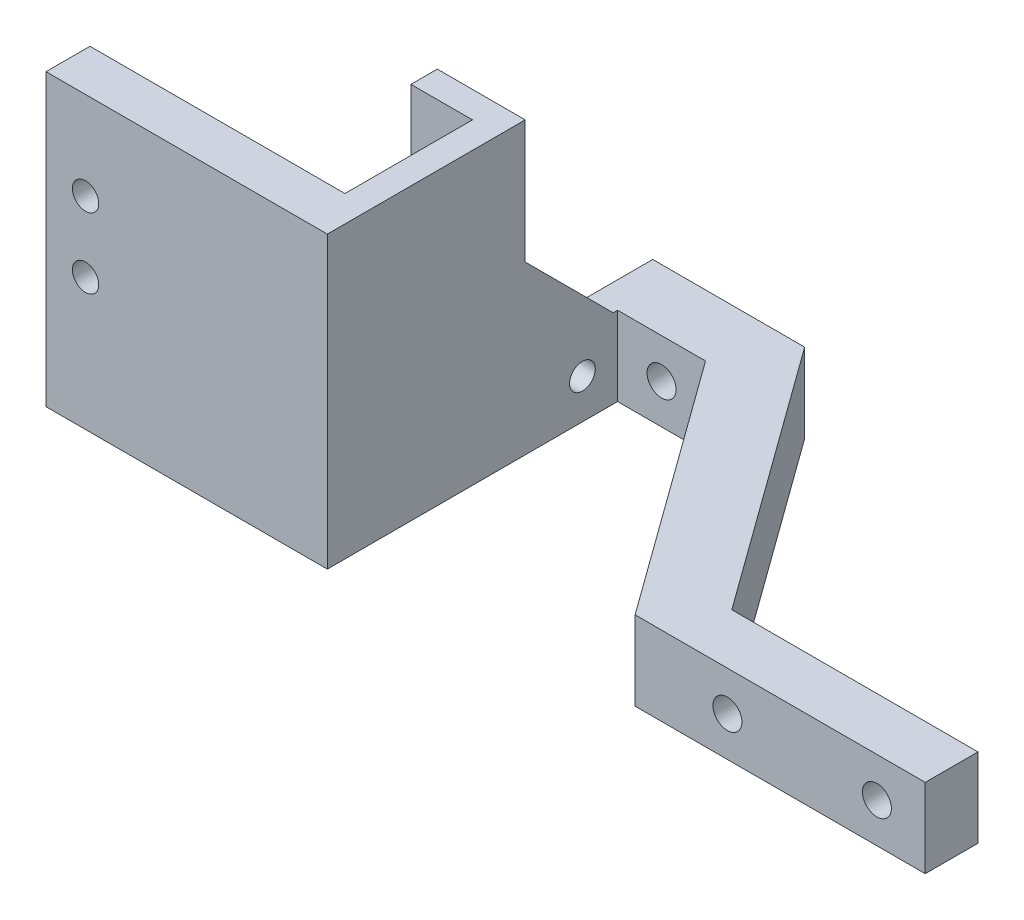
ISO-10303-21;
HEADER;
FILE_DESCRIPTION(('STEP AP214'),'2;1');
FILE_NAME('part.step','',(''),(''),'','','');
FILE_SCHEMA(('AUTOMOTIVE_DESIGN { 1 0 10303 214 1 1 1 1 }'));
ENDSEC;
DATA;
#1=APPLICATION_CONTEXT('core data for automotive mechanical design processes');
#2=APPLICATION_PROTOCOL_DEFINITION('international standard','automotive_design',2000,#1);
#3=PRODUCT_CONTEXT('',#1,'mechanical');
#4=PRODUCT('Part','Part','',(#3));
#5=PRODUCT_RELATED_PRODUCT_CATEGORY('part','',(#4));
#6=PRODUCT_DEFINITION_FORMATION('','',#4);
#7=PRODUCT_DEFINITION_CONTEXT('part definition',#1,'design');
#8=PRODUCT_DEFINITION('design','',#6,#7);
#9=PRODUCT_DEFINITION_SHAPE('','',#8);
#10=(LENGTH_UNIT() NAMED_UNIT(*) SI_UNIT(.MILLI.,.METRE.));
#11=(NAMED_UNIT(*) PLANE_ANGLE_UNIT() SI_UNIT($,.RADIAN.));
#12=(NAMED_UNIT(*) SI_UNIT($,.STERADIAN.) SOLID_ANGLE_UNIT());
#13=UNCERTAINTY_MEASURE_WITH_UNIT(LENGTH_MEASURE(1.E-05),#10,'distance_accuracy_value','');
#14=(GEOMETRIC_REPRESENTATION_CONTEXT(3) GLOBAL_UNCERTAINTY_ASSIGNED_CONTEXT((#13)) GLOBAL_UNIT_ASSIGNED_CONTEXT((#10,
#11,#12)) REPRESENTATION_CONTEXT('',''));
#15=CARTESIAN_POINT('',(0.,0.,0.));
#16=DIRECTION('',(0.,0.,1.));
#17=DIRECTION('',(1.,0.,0.));
#18=AXIS2_PLACEMENT_3D('',#15,#16,#17);
#19=CARTESIAN_POINT('',(28.,9.,-6.));
#20=DIRECTION('',(0.,-1.,0.));
#21=DIRECTION('',(0.,0.,1.));
#22=AXIS2_PLACEMENT_3D('',#19,#20,#21);
#23=PLANE('',#22);
#24=DIRECTION('',(0.,0.,1.));
#25=VECTOR('',#24,1.);
#26=CARTESIAN_POINT('',(-36.,9.,-36.0090319770748));
#27=LINE('',#26,#25);
#28=CARTESIAN_POINT('',(-36.,9.,-29.0090319770748));
#29=VERTEX_POINT('',#28);
#30=CARTESIAN_POINT('',(-36.,9.,-28.5045159885374));
#31=VERTEX_POINT('',#30);
#32=EDGE_CURVE('E249',#29,#31,#27,.T.);
#33=ORIENTED_EDGE('',*,*,#32,.F.);
#34=DIRECTION('',(-1.,0.,0.));
#35=VECTOR('',#34,1.);
#36=CARTESIAN_POINT('',(-26.,9.,-29.0090319770748));
#37=LINE('',#36,#35);
#38=CARTESIAN_POINT('',(-26.,9.,-29.0090319770748));
#39=VERTEX_POINT('',#38);
#40=EDGE_CURVE('E267',#39,#29,#37,.T.);
#41=ORIENTED_EDGE('',*,*,#40,.F.);
#42=DIRECTION('',(-0.58638999951857,0.,-0.810028868908147));
#43=VECTOR('',#42,1.);
#44=CARTESIAN_POINT('',(-5.,9.,0.));
#45=LINE('',#44,#43);
#46=CARTESIAN_POINT('',(-5.,9.,0.));
#47=VERTEX_POINT('',#46);
#48=EDGE_CURVE('E271',#47,#39,#45,.T.);
#49=ORIENTED_EDGE('',*,*,#48,.F.);
#50=DIRECTION('',(-1.,0.,0.));
#51=VECTOR('',#50,1.);
#52=CARTESIAN_POINT('',(28.,9.,0.));
#53=LINE('',#52,#51);
#54=CARTESIAN_POINT('',(28.,9.,0.));
#55=VERTEX_POINT('',#54);
#56=EDGE_CURVE('E312',#55,#47,#53,.T.);
#57=ORIENTED_EDGE('',*,*,#56,.F.);
#58=DIRECTION('',(0.,0.,1.));
#59=VECTOR('',#58,1.);
#60=CARTESIAN_POINT('',(28.,9.,-6.));
#61=LINE('',#60,#59);
#62=CARTESIAN_POINT('',(28.,9.,-6.));
#63=VERTEX_POINT('',#62);
#64=EDGE_CURVE('E320',#63,#55,#61,.T.);
#65=ORIENTED_EDGE('',*,*,#64,.F.);
#66=DIRECTION('',(-1.,0.,0.));
#67=VECTOR('',#66,1.);
#68=CARTESIAN_POINT('',(28.,9.,-6.));
#69=LINE('',#68,#67);
#70=CARTESIAN_POINT('',(0.,9.,-6.));
#71=VERTEX_POINT('',#70);
#72=EDGE_CURVE('E317',#63,#71,#69,.T.);
#73=ORIENTED_EDGE('',*,*,#72,.T.);
#74=DIRECTION('',(0.58638999951857,0.,0.810028868908147));
#75=VECTOR('',#74,1.);
#76=CARTESIAN_POINT('',(-21.723912470316,9.,-36.0090319770748));
#77=LINE('',#76,#75);
#78=CARTESIAN_POINT('',(-21.723912470316,9.,-36.0090319770748));
#79=VERTEX_POINT('',#78);
#80=EDGE_CURVE('E274',#79,#71,#77,.T.);
#81=ORIENTED_EDGE('',*,*,#80,.F.);
#82=DIRECTION('',(1.,0.,0.));
#83=VECTOR('',#82,1.);
#84=CARTESIAN_POINT('',(-36.,9.,-36.0090319770748));
#85=LINE('',#84,#83);
#86=CARTESIAN_POINT('',(-39.,9.00000000000001,-36.0090319770748));
#87=VERTEX_POINT('',#86);
#88=EDGE_CURVE('E264',#87,#79,#85,.T.);
#89=ORIENTED_EDGE('',*,*,#88,.F.);
#90=DIRECTION('',(0.,0.,-1.));
#91=VECTOR('',#90,1.);
#92=CARTESIAN_POINT('',(-39.,9.,-36.0090319770748));
#93=LINE('',#92,#91);
#94=CARTESIAN_POINT('',(-39.,9.,-28.5045159885374));
#95=VERTEX_POINT('',#94);
#96=EDGE_CURVE('E247',#95,#87,#93,.T.);
#97=ORIENTED_EDGE('',*,*,#96,.F.);
#98=DIRECTION('',(-1.,0.,0.));
#99=VECTOR('',#98,1.);
#100=CARTESIAN_POINT('',(-39.,9.,-28.5045159885374));
#101=LINE('',#100,#99);
#102=EDGE_CURVE('E336',#31,#95,#101,.T.);
#103=ORIENTED_EDGE('',*,*,#102,.F.);
#104=EDGE_LOOP('',(#33,#41,#49,#57,#65,#73,#81,#89,#97,#103));
#105=FACE_BOUND('',#104,.T.);
#106=ADVANCED_FACE('F35',(#105),#23,.F.);
#107=CARTESIAN_POINT('',(0.,0.,-1.00000000000003));
#108=DIRECTION('',(0.,0.,-1.));
#109=DIRECTION('',(1.,0.,0.));
#110=AXIS2_PLACEMENT_3D('',#107,#108,#109);
#111=PLANE('',#110);
#112=CARTESIAN_POINT('',(-63.5,23.,-1.00000000000003));
#113=DIRECTION('',(0.,0.,1.));
#114=DIRECTION('',(1.,0.,0.));
#115=AXIS2_PLACEMENT_3D('',#112,#113,#114);
#116=CIRCLE('',#115,1.5);
#117=CARTESIAN_POINT('',(-62.,23.,-1.00000000000003));
#118=VERTEX_POINT('',#117);
#119=EDGE_CURVE('E565',#118,#118,#116,.T.);
#120=ORIENTED_EDGE('',*,*,#119,.T.);
#121=EDGE_LOOP('',(#120));
#122=FACE_BOUND('',#121,.T.);
#123=CARTESIAN_POINT('',(-63.5,15.,-0.999999999999976));
#124=DIRECTION('',(0.,0.,-1.));
#125=DIRECTION('',(-1.,0.,0.));
#126=AXIS2_PLACEMENT_3D('',#123,#124,#125);
#127=CIRCLE('',#126,1.5);
#128=CARTESIAN_POINT('',(-65.,15.,-0.999999999999974));
#129=VERTEX_POINT('',#128);
#130=EDGE_CURVE('E213',#129,#129,#127,.T.);
#131=ORIENTED_EDGE('',*,*,#130,.F.);
#132=EDGE_LOOP('',(#131));
#133=FACE_BOUND('',#132,.T.);
#134=DIRECTION('',(0.,1.,0.));
#135=VECTOR('',#134,1.);
#136=CARTESIAN_POINT('',(-39.,49.1213489272556,-0.999999999999994));
#137=LINE('',#136,#135);
#138=CARTESIAN_POINT('',(-39.,0.,-0.999999999999994));
#139=VERTEX_POINT('',#138);
#140=CARTESIAN_POINT('',(-39.,33.,-0.999999999999999));
#141=VERTEX_POINT('',#140);
#142=EDGE_CURVE('E331',#139,#141,#137,.T.);
#143=ORIENTED_EDGE('',*,*,#142,.F.);
#144=DIRECTION('',(-1.,0.,0.));
#145=VECTOR('',#144,1.);
#146=CARTESIAN_POINT('',(-36.,0.,-0.999999999999999));
#147=LINE('',#146,#145);
#148=CARTESIAN_POINT('',(-68.,0.,-0.999999999999971));
#149=VERTEX_POINT('',#148);
#150=EDGE_CURVE('E219',#139,#149,#147,.T.);
#151=ORIENTED_EDGE('',*,*,#150,.T.);
#152=DIRECTION('',(0.,1.,0.));
#153=VECTOR('',#152,1.);
#154=CARTESIAN_POINT('',(-68.,0.,-0.999999999999971));
#155=LINE('',#154,#153);
#156=CARTESIAN_POINT('',(-68.,33.,-0.999999999999971));
#157=VERTEX_POINT('',#156);
#158=EDGE_CURVE('E222',#149,#157,#155,.T.);
#159=ORIENTED_EDGE('',*,*,#158,.T.);
#160=DIRECTION('',(1.,0.,0.));
#161=VECTOR('',#160,1.);
#162=CARTESIAN_POINT('',(-36.,33.,-0.999999999999999));
#163=LINE('',#162,#161);
#164=EDGE_CURVE('E226',#157,#141,#163,.T.);
#165=ORIENTED_EDGE('',*,*,#164,.T.);
#166=EDGE_LOOP('',(#143,#151,#159,#165));
#167=FACE_BOUND('',#166,.T.);
#168=ADVANCED_FACE('F354',(#122,#133,#167),#111,.T.);
#169=CARTESIAN_POINT('',(0.,0.,-6.));
#170=DIRECTION('',(0.,0.,-1.));
#171=DIRECTION('',(1.,0.,0.));
#172=AXIS2_PLACEMENT_3D('',#169,#170,#171);
#173=PLANE('',#172);
#174=CARTESIAN_POINT('',(5.5,4.5,-6.));
#175=DIRECTION('',(0.,0.,1.));
#176=DIRECTION('',(1.,0.,0.));
#177=AXIS2_PLACEMENT_3D('',#174,#175,#176);
#178=CIRCLE('',#177,1.65);
#179=CARTESIAN_POINT('',(7.15,4.5,-6.));
#180=VERTEX_POINT('',#179);
#181=EDGE_CURVE('E302',#180,#180,#178,.T.);
#182=ORIENTED_EDGE('',*,*,#181,.T.);
#183=EDGE_LOOP('',(#182));
#184=FACE_BOUND('',#183,.T.);
#185=DIRECTION('',(0.,-1.,0.));
#186=VECTOR('',#185,1.);
#187=CARTESIAN_POINT('',(0.,9.,-6.));
#188=LINE('',#187,#186);
#189=CARTESIAN_POINT('',(0.,0.,-6.));
#190=VERTEX_POINT('',#189);
#191=EDGE_CURVE('E308',#71,#190,#188,.T.);
#192=ORIENTED_EDGE('',*,*,#191,.F.);
#193=ORIENTED_EDGE('',*,*,#72,.F.);
#194=DIRECTION('',(0.,1.,0.));
#195=VECTOR('',#194,1.);
#196=CARTESIAN_POINT('',(28.,0.,-6.));
#197=LINE('',#196,#195);
#198=CARTESIAN_POINT('',(28.,0.,-6.));
#199=VERTEX_POINT('',#198);
#200=EDGE_CURVE('E315',#199,#63,#197,.T.);
#201=ORIENTED_EDGE('',*,*,#200,.F.);
#202=DIRECTION('',(1.,0.,0.));
#203=VECTOR('',#202,1.);
#204=CARTESIAN_POINT('',(0.,0.,-6.));
#205=LINE('',#204,#203);
#206=EDGE_CURVE('E311',#190,#199,#205,.T.);
#207=ORIENTED_EDGE('',*,*,#206,.F.);
#208=EDGE_LOOP('',(#192,#193,#201,#207));
#209=FACE_BOUND('',#208,.T.);
#210=CARTESIAN_POINT('',(22.5,4.5,-6.));
#211=DIRECTION('',(0.,0.,1.));
#212=DIRECTION('',(1.,0.,0.));
#213=AXIS2_PLACEMENT_3D('',#210,#211,#212);
#214=CIRCLE('',#213,1.65);
#215=CARTESIAN_POINT('',(24.15,4.5,-6.));
#216=VERTEX_POINT('',#215);
#217=EDGE_CURVE('E296',#216,#216,#214,.T.);
#218=ORIENTED_EDGE('',*,*,#217,.T.);
#219=EDGE_LOOP('',(#218));
#220=FACE_BOUND('',#219,.T.);
#221=ADVANCED_FACE('F387',(#184,#209,#220),#173,.T.);
#222=CARTESIAN_POINT('',(0.,0.,0.));
#223=DIRECTION('',(0.,0.,-1.));
#224=DIRECTION('',(1.,0.,0.));
#225=AXIS2_PLACEMENT_3D('',#222,#223,#224);
#226=PLANE('',#225);
#227=DIRECTION('',(1.,0.,0.));
#228=VECTOR('',#227,1.);
#229=CARTESIAN_POINT('',(0.,0.,0.));
#230=LINE('',#229,#228);
#231=CARTESIAN_POINT('',(-5.,0.,0.));
#232=VERTEX_POINT('',#231);
#233=CARTESIAN_POINT('',(28.,0.,0.));
#234=VERTEX_POINT('',#233);
#235=EDGE_CURVE('E305',#232,#234,#230,.T.);
#236=ORIENTED_EDGE('',*,*,#235,.T.);
#237=DIRECTION('',(0.,1.,0.));
#238=VECTOR('',#237,1.);
#239=CARTESIAN_POINT('',(28.,0.,0.));
#240=LINE('',#239,#238);
#241=EDGE_CURVE('E323',#234,#55,#240,.T.);
#242=ORIENTED_EDGE('',*,*,#241,.T.);
#243=ORIENTED_EDGE('',*,*,#56,.T.);
#244=DIRECTION('',(0.,-1.,0.));
#245=VECTOR('',#244,1.);
#246=CARTESIAN_POINT('',(-5.,59.9180752181973,0.));
#247=LINE('',#246,#245);
#248=EDGE_CURVE('E268',#47,#232,#247,.T.);
#249=ORIENTED_EDGE('',*,*,#248,.T.);
#250=EDGE_LOOP('',(#236,#242,#243,#249));
#251=FACE_BOUND('',#250,.T.);
#252=CARTESIAN_POINT('',(5.5,4.5,0.));
#253=DIRECTION('',(0.,0.,1.));
#254=DIRECTION('',(1.,0.,0.));
#255=AXIS2_PLACEMENT_3D('',#252,#253,#254);
#256=CIRCLE('',#255,1.65);
#257=CARTESIAN_POINT('',(7.15,4.5,0.));
#258=VERTEX_POINT('',#257);
#259=EDGE_CURVE('E299',#258,#258,#256,.T.);
#260=ORIENTED_EDGE('',*,*,#259,.F.);
#261=EDGE_LOOP('',(#260));
#262=FACE_BOUND('',#261,.T.);
#263=CARTESIAN_POINT('',(22.5,4.5,0.));
#264=DIRECTION('',(0.,0.,1.));
#265=DIRECTION('',(1.,0.,0.));
#266=AXIS2_PLACEMENT_3D('',#263,#264,#265);
#267=CIRCLE('',#266,1.65);
#268=CARTESIAN_POINT('',(24.15,4.5,0.));
#269=VERTEX_POINT('',#268);
#270=EDGE_CURVE('E295',#269,#269,#267,.T.);
#271=ORIENTED_EDGE('',*,*,#270,.F.);
#272=EDGE_LOOP('',(#271));
#273=FACE_BOUND('',#272,.T.);
#274=ADVANCED_FACE('F377',(#251,#262,#273),#226,.F.);
#275=CARTESIAN_POINT('',(0.,0.,-6.));
#276=DIRECTION('',(0.,1.,0.));
#277=DIRECTION('',(0.,0.,-1.));
#278=AXIS2_PLACEMENT_3D('',#275,#276,#277);
#279=PLANE('',#278);
#280=DIRECTION('',(0.,0.,1.));
#281=VECTOR('',#280,1.);
#282=CARTESIAN_POINT('',(-39.,0.,-36.0090319770748));
#283=LINE('',#282,#281);
#284=CARTESIAN_POINT('',(-39.,0.,-36.0090319770748));
#285=VERTEX_POINT('',#284);
#286=EDGE_CURVE('E256',#285,#139,#283,.T.);
#287=ORIENTED_EDGE('',*,*,#286,.F.);
#288=DIRECTION('',(-1.,0.,0.));
#289=VECTOR('',#288,1.);
#290=CARTESIAN_POINT('',(-36.,0.,-36.0090319770748));
#291=LINE('',#290,#289);
#292=CARTESIAN_POINT('',(-21.723912470316,0.,-36.0090319770748));
#293=VERTEX_POINT('',#292);
#294=EDGE_CURVE('E277',#293,#285,#291,.T.);
#295=ORIENTED_EDGE('',*,*,#294,.F.);
#296=DIRECTION('',(-0.58638999951857,0.,-0.810028868908147));
#297=VECTOR('',#296,1.);
#298=CARTESIAN_POINT('',(-21.723912470316,0.,-36.0090319770748));
#299=LINE('',#298,#297);
#300=EDGE_CURVE('E253',#190,#293,#299,.T.);
#301=ORIENTED_EDGE('',*,*,#300,.F.);
#302=ORIENTED_EDGE('',*,*,#206,.T.);
#303=DIRECTION('',(0.,0.,1.));
#304=VECTOR('',#303,1.);
#305=CARTESIAN_POINT('',(28.,0.,-6.));
#306=LINE('',#305,#304);
#307=EDGE_CURVE('E329',#199,#234,#306,.T.);
#308=ORIENTED_EDGE('',*,*,#307,.T.);
#309=ORIENTED_EDGE('',*,*,#235,.F.);
#310=DIRECTION('',(0.58638999951857,0.,0.810028868908147));
#311=VECTOR('',#310,1.);
#312=CARTESIAN_POINT('',(-5.,0.,0.));
#313=LINE('',#312,#311);
#314=CARTESIAN_POINT('',(-26.,0.,-29.0090319770748));
#315=VERTEX_POINT('',#314);
#316=EDGE_CURVE('E283',#315,#232,#313,.T.);
#317=ORIENTED_EDGE('',*,*,#316,.F.);
#318=DIRECTION('',(1.,0.,0.));
#319=VECTOR('',#318,1.);
#320=CARTESIAN_POINT('',(-26.,0.,-29.0090319770748));
#321=LINE('',#320,#319);
#322=CARTESIAN_POINT('',(-36.,0.,-29.0090319770748));
#323=VERTEX_POINT('',#322);
#324=EDGE_CURVE('E280',#323,#315,#321,.T.);
#325=ORIENTED_EDGE('',*,*,#324,.F.);
#326=DIRECTION('',(0.,0.,-1.));
#327=VECTOR('',#326,1.);
#328=CARTESIAN_POINT('',(-36.,0.,-36.0090319770748));
#329=LINE('',#328,#327);
#330=CARTESIAN_POINT('',(-36.,0.,4.));
#331=VERTEX_POINT('',#330);
#332=EDGE_CURVE('E246',#331,#323,#329,.T.);
#333=ORIENTED_EDGE('',*,*,#332,.F.);
#334=DIRECTION('',(1.,0.,0.));
#335=VECTOR('',#334,1.);
#336=CARTESIAN_POINT('',(-36.,0.,4.));
#337=LINE('',#336,#335);
#338=CARTESIAN_POINT('',(-68.,0.,4.00000000000003));
#339=VERTEX_POINT('',#338);
#340=EDGE_CURVE('E258',#339,#331,#337,.T.);
#341=ORIENTED_EDGE('',*,*,#340,.F.);
#342=DIRECTION('',(0.,0.,1.));
#343=VECTOR('',#342,1.);
#344=CARTESIAN_POINT('',(-68.,0.,-0.999999999999971));
#345=LINE('',#344,#343);
#346=EDGE_CURVE('E229',#149,#339,#345,.T.);
#347=ORIENTED_EDGE('',*,*,#346,.F.);
#348=ORIENTED_EDGE('',*,*,#150,.F.);
#349=EDGE_LOOP('',(#287,#295,#301,#302,#308,#309,#317,#325,#333,#341,#347,#348));
#350=FACE_BOUND('',#349,.T.);
#351=ADVANCED_FACE('F349',(#350),#279,.F.);
#352=CARTESIAN_POINT('',(28.,0.,-6.));
#353=DIRECTION('',(-1.,0.,0.));
#354=DIRECTION('',(0.,0.,-1.));
#355=AXIS2_PLACEMENT_3D('',#352,#353,#354);
#356=PLANE('',#355);
#357=ORIENTED_EDGE('',*,*,#241,.F.);
#358=ORIENTED_EDGE('',*,*,#307,.F.);
#359=ORIENTED_EDGE('',*,*,#200,.T.);
#360=ORIENTED_EDGE('',*,*,#64,.T.);
#361=EDGE_LOOP('',(#357,#358,#359,#360));
#362=FACE_BOUND('',#361,.T.);
#363=ADVANCED_FACE('F383',(#362),#356,.F.);
#364=CARTESIAN_POINT('',(5.5,4.5,-6.));
#365=DIRECTION('',(0.,0.,1.));
#366=DIRECTION('',(-1.,0.,0.));
#367=AXIS2_PLACEMENT_3D('',#364,#365,#366);
#368=CYLINDRICAL_SURFACE('',#367,1.65);
#369=ORIENTED_EDGE('',*,*,#181,.F.);
#370=EDGE_LOOP('',(#369));
#371=FACE_BOUND('',#370,.T.);
#372=ORIENTED_EDGE('',*,*,#259,.T.);
#373=EDGE_LOOP('',(#372));
#374=FACE_BOUND('',#373,.T.);
#375=ADVANCED_FACE('F422',(#371,#374),#368,.F.);
#376=CARTESIAN_POINT('',(22.5,4.5,-6.));
#377=DIRECTION('',(0.,0.,1.));
#378=DIRECTION('',(-1.,0.,0.));
#379=AXIS2_PLACEMENT_3D('',#376,#377,#378);
#380=CYLINDRICAL_SURFACE('',#379,1.65);
#381=ORIENTED_EDGE('',*,*,#217,.F.);
#382=EDGE_LOOP('',(#381));
#383=FACE_BOUND('',#382,.T.);
#384=ORIENTED_EDGE('',*,*,#270,.T.);
#385=EDGE_LOOP('',(#384));
#386=FACE_BOUND('',#385,.T.);
#387=ADVANCED_FACE('F436',(#383,#386),#380,.F.);
#388=CARTESIAN_POINT('',(-5.,59.9180752181973,0.));
#389=DIRECTION('',(-0.810028868908147,0.,0.58638999951857));
#390=DIRECTION('',(-0.58638999951857,0.,-0.810028868908147));
#391=AXIS2_PLACEMENT_3D('',#388,#389,#390);
#392=PLANE('',#391);
#393=ORIENTED_EDGE('',*,*,#48,.T.);
#394=DIRECTION('',(0.,-1.,0.));
#395=VECTOR('',#394,1.);
#396=CARTESIAN_POINT('',(-26.,59.9180752181973,-29.0090319770748));
#397=LINE('',#396,#395);
#398=EDGE_CURVE('E288',#39,#315,#397,.T.);
#399=ORIENTED_EDGE('',*,*,#398,.T.);
#400=ORIENTED_EDGE('',*,*,#316,.T.);
#401=ORIENTED_EDGE('',*,*,#248,.F.);
#402=EDGE_LOOP('',(#393,#399,#400,#401));
#403=FACE_BOUND('',#402,.T.);
#404=ADVANCED_FACE('F374',(#403),#392,.T.);
#405=CARTESIAN_POINT('',(-26.,59.9180752181973,-29.0090319770748));
#406=DIRECTION('',(0.,0.,1.));
#407=DIRECTION('',(-1.,0.,0.));
#408=AXIS2_PLACEMENT_3D('',#405,#406,#407);
#409=PLANE('',#408);
#410=CARTESIAN_POINT('',(-31.,4.5,-29.0090319770748));
#411=DIRECTION('',(0.,0.,-1.));
#412=DIRECTION('',(-1.,0.,0.));
#413=AXIS2_PLACEMENT_3D('',#410,#411,#412);
#414=CIRCLE('',#413,1.65);
#415=CARTESIAN_POINT('',(-32.65,4.5,-29.0090319770748));
#416=VERTEX_POINT('',#415);
#417=EDGE_CURVE('E243',#416,#416,#414,.F.);
#418=ORIENTED_EDGE('',*,*,#417,.F.);
#419=EDGE_LOOP('',(#418));
#420=FACE_BOUND('',#419,.T.);
#421=ORIENTED_EDGE('',*,*,#40,.T.);
#422=DIRECTION('',(0.,-1.,0.));
#423=VECTOR('',#422,1.);
#424=CARTESIAN_POINT('',(-36.,59.9180752181973,-29.0090319770748));
#425=LINE('',#424,#423);
#426=EDGE_CURVE('E290',#29,#323,#425,.T.);
#427=ORIENTED_EDGE('',*,*,#426,.T.);
#428=ORIENTED_EDGE('',*,*,#324,.T.);
#429=ORIENTED_EDGE('',*,*,#398,.F.);
#430=EDGE_LOOP('',(#421,#427,#428,#429));
#431=FACE_BOUND('',#430,.T.);
#432=ADVANCED_FACE('F370',(#420,#431),#409,.T.);
#433=CARTESIAN_POINT('',(-36.,59.9180752181973,-36.0090319770748));
#434=DIRECTION('',(0.,0.,-1.));
#435=DIRECTION('',(1.,0.,0.));
#436=AXIS2_PLACEMENT_3D('',#433,#434,#435);
#437=PLANE('',#436);
#438=CARTESIAN_POINT('',(-31.,4.5,-36.0090319770748));
#439=DIRECTION('',(0.,0.,1.));
#440=DIRECTION('',(1.,0.,0.));
#441=AXIS2_PLACEMENT_3D('',#438,#439,#440);
#442=CIRCLE('',#441,1.65);
#443=CARTESIAN_POINT('',(-29.35,4.5,-36.0090319770748));
#444=VERTEX_POINT('',#443);
#445=EDGE_CURVE('E236',#444,#444,#442,.T.);
#446=ORIENTED_EDGE('',*,*,#445,.T.);
#447=EDGE_LOOP('',(#446));
#448=FACE_BOUND('',#447,.T.);
#449=ORIENTED_EDGE('',*,*,#88,.T.);
#450=DIRECTION('',(0.,-1.,0.));
#451=VECTOR('',#450,1.);
#452=CARTESIAN_POINT('',(-21.723912470316,59.9180752181973,-36.0090319770748));
#453=LINE('',#452,#451);
#454=EDGE_CURVE('E285',#79,#293,#453,.T.);
#455=ORIENTED_EDGE('',*,*,#454,.T.);
#456=ORIENTED_EDGE('',*,*,#294,.T.);
#457=DIRECTION('',(0.,-1.,0.));
#458=VECTOR('',#457,1.);
#459=CARTESIAN_POINT('',(-39.,49.1213489272556,-36.0090319770748));
#460=LINE('',#459,#458);
#461=EDGE_CURVE('E261',#87,#285,#460,.T.);
#462=ORIENTED_EDGE('',*,*,#461,.F.);
#463=EDGE_LOOP('',(#449,#455,#456,#462));
#464=FACE_BOUND('',#463,.T.);
#465=ADVANCED_FACE('F347',(#448,#464),#437,.T.);
#466=CARTESIAN_POINT('',(-21.723912470316,59.9180752181973,-36.0090319770748));
#467=DIRECTION('',(0.810028868908147,0.,-0.58638999951857));
#468=DIRECTION('',(0.58638999951857,0.,0.810028868908147));
#469=AXIS2_PLACEMENT_3D('',#466,#467,#468);
#470=PLANE('',#469);
#471=ORIENTED_EDGE('',*,*,#80,.T.);
#472=ORIENTED_EDGE('',*,*,#191,.T.);
#473=ORIENTED_EDGE('',*,*,#300,.T.);
#474=ORIENTED_EDGE('',*,*,#454,.F.);
#475=EDGE_LOOP('',(#471,#472,#473,#474));
#476=FACE_BOUND('',#475,.T.);
#477=ADVANCED_FACE('F390',(#476),#470,.T.);
#478=CARTESIAN_POINT('',(-36.,49.1213489272556,-36.0090319770748));
#479=DIRECTION('',(1.,0.,0.));
#480=DIRECTION('',(0.,0.,1.));
#481=AXIS2_PLACEMENT_3D('',#478,#479,#480);
#482=PLANE('',#481);
#483=CARTESIAN_POINT('',(-36.,4.5,-25.0090319770748));
#484=DIRECTION('',(-1.,0.,0.));
#485=DIRECTION('',(0.,0.,1.));
#486=AXIS2_PLACEMENT_3D('',#483,#484,#485);
#487=CIRCLE('',#486,1.46285788975288);
#488=CARTESIAN_POINT('',(-36.,4.5,-23.5461740873219));
#489=VERTEX_POINT('',#488);
#490=EDGE_CURVE('E564',#489,#489,#487,.F.);
#491=ORIENTED_EDGE('',*,*,#490,.F.);
#492=EDGE_LOOP('',(#491));
#493=FACE_BOUND('',#492,.T.);
#494=DIRECTION('',(0.,-1.,0.));
#495=VECTOR('',#494,1.);
#496=CARTESIAN_POINT('',(-36.,49.1213489272556,4.));
#497=LINE('',#496,#495);
#498=CARTESIAN_POINT('',(-36.,33.,4.));
#499=VERTEX_POINT('',#498);
#500=EDGE_CURVE('E250',#499,#331,#497,.T.);
#501=ORIENTED_EDGE('',*,*,#500,.T.);
#502=ORIENTED_EDGE('',*,*,#332,.T.);
#503=ORIENTED_EDGE('',*,*,#426,.F.);
#504=ORIENTED_EDGE('',*,*,#32,.T.);
#505=DIRECTION('',(0.,0.707106781186551,0.707106781186544));
#506=VECTOR('',#505,1.);
#507=CARTESIAN_POINT('',(-36.,19.0000000000001,-18.5045159885374));
#508=LINE('',#507,#506);
#509=CARTESIAN_POINT('',(-36.,19.0000000000001,-18.5045159885374));
#510=VERTEX_POINT('',#509);
#511=EDGE_CURVE('E43',#510,#31,#508,.F.);
#512=ORIENTED_EDGE('',*,*,#511,.F.);
#513=DIRECTION('',(0.,-1.,0.));
#514=VECTOR('',#513,1.);
#515=CARTESIAN_POINT('',(-36.,50.7597319797615,-18.5045159885374));
#516=LINE('',#515,#514);
#517=CARTESIAN_POINT('',(-36.,33.,-18.5045159885374));
#518=VERTEX_POINT('',#517);
#519=EDGE_CURVE('E204',#518,#510,#516,.T.);
#520=ORIENTED_EDGE('',*,*,#519,.F.);
#521=DIRECTION('',(0.,0.,1.));
#522=VECTOR('',#521,1.);
#523=CARTESIAN_POINT('',(-36.,33.,-0.999999999999999));
#524=LINE('',#523,#522);
#525=EDGE_CURVE('E233',#518,#499,#524,.T.);
#526=ORIENTED_EDGE('',*,*,#525,.T.);
#527=EDGE_LOOP('',(#501,#502,#503,#504,#512,#520,#526));
#528=FACE_BOUND('',#527,.T.);
#529=ADVANCED_FACE('F365',(#493,#528),#482,.T.);
#530=CARTESIAN_POINT('',(-36.,49.1213489272556,4.));
#531=DIRECTION('',(0.,0.,1.));
#532=DIRECTION('',(-1.,0.,0.));
#533=AXIS2_PLACEMENT_3D('',#530,#531,#532);
#534=PLANE('',#533);
#535=CARTESIAN_POINT('',(-63.5,23.,4.00000000000002));
#536=DIRECTION('',(0.,0.,-1.));
#537=DIRECTION('',(-1.,0.,0.));
#538=AXIS2_PLACEMENT_3D('',#535,#536,#537);
#539=CIRCLE('',#538,1.5);
#540=CARTESIAN_POINT('',(-65.,23.,4.00000000000003));
#541=VERTEX_POINT('',#540);
#542=EDGE_CURVE('E186',#541,#541,#539,.F.);
#543=ORIENTED_EDGE('',*,*,#542,.F.);
#544=EDGE_LOOP('',(#543));
#545=FACE_BOUND('',#544,.T.);
#546=DIRECTION('',(1.,0.,0.));
#547=VECTOR('',#546,1.);
#548=CARTESIAN_POINT('',(-36.,33.,4.));
#549=LINE('',#548,#547);
#550=CARTESIAN_POINT('',(-68.,33.,4.00000000000003));
#551=VERTEX_POINT('',#550);
#552=EDGE_CURVE('E223',#551,#499,#549,.T.);
#553=ORIENTED_EDGE('',*,*,#552,.F.);
#554=DIRECTION('',(0.,1.,0.));
#555=VECTOR('',#554,1.);
#556=CARTESIAN_POINT('',(-68.,0.,4.00000000000003));
#557=LINE('',#556,#555);
#558=EDGE_CURVE('E216',#339,#551,#557,.T.);
#559=ORIENTED_EDGE('',*,*,#558,.F.);
#560=ORIENTED_EDGE('',*,*,#340,.T.);
#561=ORIENTED_EDGE('',*,*,#500,.F.);
#562=EDGE_LOOP('',(#553,#559,#560,#561));
#563=FACE_BOUND('',#562,.T.);
#564=CARTESIAN_POINT('',(-63.5,15.,4.00000000000002));
#565=DIRECTION('',(0.,0.,-1.));
#566=DIRECTION('',(-1.,0.,0.));
#567=AXIS2_PLACEMENT_3D('',#564,#565,#566);
#568=CIRCLE('',#567,1.5);
#569=CARTESIAN_POINT('',(-65.,15.,4.00000000000002));
#570=VERTEX_POINT('',#569);
#571=EDGE_CURVE('E208',#570,#570,#568,.T.);
#572=ORIENTED_EDGE('',*,*,#571,.T.);
#573=EDGE_LOOP('',(#572));
#574=FACE_BOUND('',#573,.T.);
#575=ADVANCED_FACE('F395',(#545,#563,#574),#534,.T.);
#576=CARTESIAN_POINT('',(-39.,49.1213489272556,-36.0090319770748));
#577=DIRECTION('',(-1.,0.,0.));
#578=DIRECTION('',(0.,0.,-1.));
#579=AXIS2_PLACEMENT_3D('',#576,#577,#578);
#580=PLANE('',#579);
#581=CARTESIAN_POINT('',(-39.,4.5,-25.0090319770748));
#582=DIRECTION('',(1.,0.,0.));
#583=DIRECTION('',(0.,0.,-1.));
#584=AXIS2_PLACEMENT_3D('',#581,#582,#583);
#585=CIRCLE('',#584,1.46285788975288);
#586=CARTESIAN_POINT('',(-39.,4.5,-26.4718898668277));
#587=VERTEX_POINT('',#586);
#588=EDGE_CURVE('E561',#587,#587,#585,.T.);
#589=ORIENTED_EDGE('',*,*,#588,.T.);
#590=EDGE_LOOP('',(#589));
#591=FACE_BOUND('',#590,.T.);
#592=DIRECTION('',(0.,-1.,0.));
#593=VECTOR('',#592,1.);
#594=CARTESIAN_POINT('',(-39.,49.1213489272556,-15.5045159885374));
#595=LINE('',#594,#593);
#596=CARTESIAN_POINT('',(-39.,33.,-15.5045159885374));
#597=VERTEX_POINT('',#596);
#598=CARTESIAN_POINT('',(-39.,22.85,-15.5045159885374));
#599=VERTEX_POINT('',#598);
#600=EDGE_CURVE('E177',#597,#599,#595,.T.);
#601=ORIENTED_EDGE('',*,*,#600,.T.);
#602=DIRECTION('',(0.,0.,-1.));
#603=VECTOR('',#602,1.);
#604=CARTESIAN_POINT('',(-39.,22.85,8.39365339742184));
#605=LINE('',#604,#603);
#606=CARTESIAN_POINT('',(-39.,22.85,-18.5045159885374));
#607=VERTEX_POINT('',#606);
#608=EDGE_CURVE('E183',#599,#607,#605,.T.);
#609=ORIENTED_EDGE('',*,*,#608,.T.);
#610=DIRECTION('',(0.,1.,0.));
#611=VECTOR('',#610,1.);
#612=CARTESIAN_POINT('',(-39.,0.,-18.5045159885374));
#613=LINE('',#612,#611);
#614=CARTESIAN_POINT('',(-39.,19.0000000000001,-18.5045159885374));
#615=VERTEX_POINT('',#614);
#616=EDGE_CURVE('E181',#615,#607,#613,.T.);
#617=ORIENTED_EDGE('',*,*,#616,.F.);
#618=DIRECTION('',(0.,-0.707106781186551,-0.707106781186544));
#619=VECTOR('',#618,1.);
#620=CARTESIAN_POINT('',(-39.,19.0000000000001,-18.5045159885374));
#621=LINE('',#620,#619);
#622=EDGE_CURVE('E11',#95,#615,#621,.F.);
#623=ORIENTED_EDGE('',*,*,#622,.F.);
#624=ORIENTED_EDGE('',*,*,#96,.T.);
#625=ORIENTED_EDGE('',*,*,#461,.T.);
#626=ORIENTED_EDGE('',*,*,#286,.T.);
#627=ORIENTED_EDGE('',*,*,#142,.T.);
#628=DIRECTION('',(0.,0.,-1.));
#629=VECTOR('',#628,1.);
#630=CARTESIAN_POINT('',(-39.,33.,-0.999999999999999));
#631=LINE('',#630,#629);
#632=EDGE_CURVE('E205',#141,#597,#631,.T.);
#633=ORIENTED_EDGE('',*,*,#632,.T.);
#634=EDGE_LOOP('',(#601,#609,#617,#623,#624,#625,#626,#627,#633));
#635=FACE_BOUND('',#634,.T.);
#636=ADVANCED_FACE('F342',(#591,#635),#580,.T.);
#637=CARTESIAN_POINT('',(-31.,4.5,-24.3421272212436));
#638=DIRECTION('',(0.,0.,-1.));
#639=DIRECTION('',(1.,0.,0.));
#640=AXIS2_PLACEMENT_3D('',#637,#638,#639);
#641=CYLINDRICAL_SURFACE('',#640,1.65);
#642=ORIENTED_EDGE('',*,*,#445,.F.);
#643=EDGE_LOOP('',(#642));
#644=FACE_BOUND('',#643,.T.);
#645=ORIENTED_EDGE('',*,*,#417,.T.);
#646=EDGE_LOOP('',(#645));
#647=FACE_BOUND('',#646,.T.);
#648=ADVANCED_FACE('F408',(#644,#647),#641,.F.);
#649=CARTESIAN_POINT('',(-36.,33.,-0.999999999999999));
#650=DIRECTION('',(0.,1.,0.));
#651=DIRECTION('',(0.,0.,-1.));
#652=AXIS2_PLACEMENT_3D('',#649,#650,#651);
#653=PLANE('',#652);
#654=ORIENTED_EDGE('',*,*,#632,.F.);
#655=ORIENTED_EDGE('',*,*,#164,.F.);
#656=DIRECTION('',(0.,0.,1.));
#657=VECTOR('',#656,1.);
#658=CARTESIAN_POINT('',(-68.,33.,-0.999999999999971));
#659=LINE('',#658,#657);
#660=EDGE_CURVE('E237',#157,#551,#659,.T.);
#661=ORIENTED_EDGE('',*,*,#660,.T.);
#662=ORIENTED_EDGE('',*,*,#552,.T.);
#663=ORIENTED_EDGE('',*,*,#525,.F.);
#664=DIRECTION('',(1.,0.,0.));
#665=VECTOR('',#664,1.);
#666=CARTESIAN_POINT('',(-36.,33.,-18.5045159885374));
#667=LINE('',#666,#665);
#668=CARTESIAN_POINT('',(-46.,33.,-18.5045159885374));
#669=VERTEX_POINT('',#668);
#670=EDGE_CURVE('E209',#669,#518,#667,.T.);
#671=ORIENTED_EDGE('',*,*,#670,.F.);
#672=DIRECTION('',(0.,0.,1.));
#673=VECTOR('',#672,1.);
#674=CARTESIAN_POINT('',(-46.,33.,-18.5045159885374));
#675=LINE('',#674,#673);
#676=CARTESIAN_POINT('',(-46.,33.,-15.5045159885374));
#677=VERTEX_POINT('',#676);
#678=EDGE_CURVE('E174',#669,#677,#675,.T.);
#679=ORIENTED_EDGE('',*,*,#678,.T.);
#680=DIRECTION('',(-1.,0.,0.));
#681=VECTOR('',#680,1.);
#682=CARTESIAN_POINT('',(-36.,33.,-15.5045159885374));
#683=LINE('',#682,#681);
#684=EDGE_CURVE('E197',#597,#677,#683,.T.);
#685=ORIENTED_EDGE('',*,*,#684,.F.);
#686=EDGE_LOOP('',(#654,#655,#661,#662,#663,#671,#679,#685));
#687=FACE_BOUND('',#686,.T.);
#688=ADVANCED_FACE('F361',(#687),#653,.T.);
#689=CARTESIAN_POINT('',(-68.,0.,-0.999999999999971));
#690=DIRECTION('',(-1.,0.,0.));
#691=DIRECTION('',(0.,0.,-1.));
#692=AXIS2_PLACEMENT_3D('',#689,#690,#691);
#693=PLANE('',#692);
#694=ORIENTED_EDGE('',*,*,#558,.T.);
#695=ORIENTED_EDGE('',*,*,#660,.F.);
#696=ORIENTED_EDGE('',*,*,#158,.F.);
#697=ORIENTED_EDGE('',*,*,#346,.T.);
#698=EDGE_LOOP('',(#694,#695,#696,#697));
#699=FACE_BOUND('',#698,.T.);
#700=ADVANCED_FACE('F398',(#699),#693,.T.);
#701=CARTESIAN_POINT('',(-63.5,15.,-0.999999999999976));
#702=DIRECTION('',(0.,0.,1.));
#703=DIRECTION('',(-1.,0.,0.));
#704=AXIS2_PLACEMENT_3D('',#701,#702,#703);
#705=CYLINDRICAL_SURFACE('',#704,1.5);
#706=ORIENTED_EDGE('',*,*,#130,.T.);
#707=EDGE_LOOP('',(#706));
#708=FACE_BOUND('',#707,.T.);
#709=ORIENTED_EDGE('',*,*,#571,.F.);
#710=EDGE_LOOP('',(#709));
#711=FACE_BOUND('',#710,.T.);
#712=ADVANCED_FACE('F400',(#708,#711),#705,.F.);
#713=CARTESIAN_POINT('',(-36.,50.7597319797615,-18.5045159885374));
#714=DIRECTION('',(0.,0.,1.));
#715=DIRECTION('',(-1.,0.,0.));
#716=AXIS2_PLACEMENT_3D('',#713,#714,#715);
#717=PLANE('',#716);
#718=CARTESIAN_POINT('',(-41.65,27.5,-18.5045159885374));
#719=DIRECTION('',(0.,0.,1.));
#720=DIRECTION('',(1.,0.,0.));
#721=AXIS2_PLACEMENT_3D('',#718,#719,#720);
#722=CIRCLE('',#721,1.65);
#723=CARTESIAN_POINT('',(-40.,27.5,-18.5045159885374));
#724=VERTEX_POINT('',#723);
#725=EDGE_CURVE('E168',#724,#724,#722,.T.);
#726=ORIENTED_EDGE('',*,*,#725,.T.);
#727=EDGE_LOOP('',(#726));
#728=FACE_BOUND('',#727,.T.);
#729=ORIENTED_EDGE('',*,*,#616,.T.);
#730=DIRECTION('',(-1.,0.,0.));
#731=VECTOR('',#730,1.);
#732=CARTESIAN_POINT('',(-46.,22.85,-18.5045159885374));
#733=LINE('',#732,#731);
#734=CARTESIAN_POINT('',(-46.,22.85,-18.5045159885374));
#735=VERTEX_POINT('',#734);
#736=EDGE_CURVE('E163',#607,#735,#733,.T.);
#737=ORIENTED_EDGE('',*,*,#736,.T.);
#738=DIRECTION('',(0.,1.,0.));
#739=VECTOR('',#738,1.);
#740=CARTESIAN_POINT('',(-46.,-10.4403065089105,-18.5045159885374));
#741=LINE('',#740,#739);
#742=EDGE_CURVE('E171',#735,#669,#741,.T.);
#743=ORIENTED_EDGE('',*,*,#742,.T.);
#744=ORIENTED_EDGE('',*,*,#670,.T.);
#745=ORIENTED_EDGE('',*,*,#519,.T.);
#746=DIRECTION('',(1.,0.,0.));
#747=VECTOR('',#746,1.);
#748=CARTESIAN_POINT('',(-36.,19.0000000000001,-18.5045159885374));
#749=LINE('',#748,#747);
#750=EDGE_CURVE('E334',#615,#510,#749,.T.);
#751=ORIENTED_EDGE('',*,*,#750,.F.);
#752=EDGE_LOOP('',(#729,#737,#743,#744,#745,#751));
#753=FACE_BOUND('',#752,.T.);
#754=ADVANCED_FACE('F180',(#728,#753),#717,.F.);
#755=CARTESIAN_POINT('',(-46.,-10.4403065089105,-18.5045159885374));
#756=DIRECTION('',(1.,0.,0.));
#757=DIRECTION('',(0.,0.,1.));
#758=AXIS2_PLACEMENT_3D('',#755,#756,#757);
#759=PLANE('',#758);
#760=DIRECTION('',(0.,1.,0.));
#761=VECTOR('',#760,1.);
#762=CARTESIAN_POINT('',(-46.,-10.4403065089105,-15.5045159885374));
#763=LINE('',#762,#761);
#764=CARTESIAN_POINT('',(-46.,22.85,-15.5045159885374));
#765=VERTEX_POINT('',#764);
#766=EDGE_CURVE('E178',#765,#677,#763,.T.);
#767=ORIENTED_EDGE('',*,*,#766,.T.);
#768=ORIENTED_EDGE('',*,*,#678,.F.);
#769=ORIENTED_EDGE('',*,*,#742,.F.);
#770=DIRECTION('',(0.,0.,-1.));
#771=VECTOR('',#770,1.);
#772=CARTESIAN_POINT('',(-46.,22.85,8.39365339742184));
#773=LINE('',#772,#771);
#774=EDGE_CURVE('E158',#765,#735,#773,.T.);
#775=ORIENTED_EDGE('',*,*,#774,.F.);
#776=EDGE_LOOP('',(#767,#768,#769,#775));
#777=FACE_BOUND('',#776,.T.);
#778=ADVANCED_FACE('F172',(#777),#759,.F.);
#779=CARTESIAN_POINT('',(-36.,-10.4403065089105,-15.5045159885374));
#780=DIRECTION('',(0.,0.,1.));
#781=DIRECTION('',(-1.,0.,0.));
#782=AXIS2_PLACEMENT_3D('',#779,#780,#781);
#783=PLANE('',#782);
#784=DIRECTION('',(-1.,0.,0.));
#785=VECTOR('',#784,1.);
#786=CARTESIAN_POINT('',(-46.,22.85,-15.5045159885374));
#787=LINE('',#786,#785);
#788=EDGE_CURVE('E165',#599,#765,#787,.T.);
#789=ORIENTED_EDGE('',*,*,#788,.F.);
#790=ORIENTED_EDGE('',*,*,#600,.F.);
#791=ORIENTED_EDGE('',*,*,#684,.T.);
#792=ORIENTED_EDGE('',*,*,#766,.F.);
#793=EDGE_LOOP('',(#789,#790,#791,#792));
#794=FACE_BOUND('',#793,.T.);
#795=CARTESIAN_POINT('',(-41.65,27.5,-15.5045159885374));
#796=DIRECTION('',(0.,0.,-1.));
#797=DIRECTION('',(-1.,0.,0.));
#798=AXIS2_PLACEMENT_3D('',#795,#796,#797);
#799=CIRCLE('',#798,1.65);
#800=CARTESIAN_POINT('',(-43.3,27.5,-15.5045159885374));
#801=VERTEX_POINT('',#800);
#802=EDGE_CURVE('E194',#801,#801,#799,.F.);
#803=ORIENTED_EDGE('',*,*,#802,.F.);
#804=EDGE_LOOP('',(#803));
#805=FACE_BOUND('',#804,.T.);
#806=ADVANCED_FACE('F359',(#794,#805),#783,.T.);
#807=CARTESIAN_POINT('',(-41.65,27.5,-10.8376112327062));
#808=DIRECTION('',(0.,0.,-1.));
#809=DIRECTION('',(1.,0.,0.));
#810=AXIS2_PLACEMENT_3D('',#807,#808,#809);
#811=CYLINDRICAL_SURFACE('',#810,1.65);
#812=ORIENTED_EDGE('',*,*,#725,.F.);
#813=EDGE_LOOP('',(#812));
#814=FACE_BOUND('',#813,.T.);
#815=ORIENTED_EDGE('',*,*,#802,.T.);
#816=EDGE_LOOP('',(#815));
#817=FACE_BOUND('',#816,.T.);
#818=ADVANCED_FACE('F510',(#814,#817),#811,.F.);
#819=CARTESIAN_POINT('',(-46.,22.85,8.39365339742184));
#820=DIRECTION('',(0.,1.,0.));
#821=DIRECTION('',(0.,0.,-1.));
#822=AXIS2_PLACEMENT_3D('',#819,#820,#821);
#823=PLANE('',#822);
#824=ORIENTED_EDGE('',*,*,#608,.F.);
#825=ORIENTED_EDGE('',*,*,#788,.T.);
#826=ORIENTED_EDGE('',*,*,#774,.T.);
#827=ORIENTED_EDGE('',*,*,#736,.F.);
#828=EDGE_LOOP('',(#824,#825,#826,#827));
#829=FACE_BOUND('',#828,.T.);
#830=ADVANCED_FACE('F161',(#829),#823,.F.);
#831=CARTESIAN_POINT('',(-36.,19.0000000000001,-18.5045159885374));
#832=DIRECTION('',(0.,0.707106781186544,-0.707106781186551));
#833=DIRECTION('',(-1.,0.,0.));
#834=AXIS2_PLACEMENT_3D('',#831,#832,#833);
#835=PLANE('',#834);
#836=ORIENTED_EDGE('',*,*,#622,.T.);
#837=ORIENTED_EDGE('',*,*,#750,.T.);
#838=ORIENTED_EDGE('',*,*,#511,.T.);
#839=ORIENTED_EDGE('',*,*,#102,.T.);
#840=EDGE_LOOP('',(#836,#837,#838,#839));
#841=FACE_BOUND('',#840,.T.);
#842=ADVANCED_FACE('F37',(#841),#835,.T.);
#843=CARTESIAN_POINT('',(-63.5,23.,8.24264068711932));
#844=DIRECTION('',(0.,0.,-1.));
#845=DIRECTION('',(1.,0.,0.));
#846=AXIS2_PLACEMENT_3D('',#843,#844,#845);
#847=CYLINDRICAL_SURFACE('',#846,1.5);
#848=ORIENTED_EDGE('',*,*,#119,.F.);
#849=EDGE_LOOP('',(#848));
#850=FACE_BOUND('',#849,.T.);
#851=ORIENTED_EDGE('',*,*,#542,.T.);
#852=EDGE_LOOP('',(#851));
#853=FACE_BOUND('',#852,.T.);
#854=ADVANCED_FACE('F536',(#850,#853),#847,.F.);
#855=CARTESIAN_POINT('',(-31.862413064974,4.5,-25.0090319770748));
#856=DIRECTION('',(-1.,0.,0.));
#857=DIRECTION('',(0.,0.,-1.));
#858=AXIS2_PLACEMENT_3D('',#855,#856,#857);
#859=CYLINDRICAL_SURFACE('',#858,1.46285788975288);
#860=ORIENTED_EDGE('',*,*,#588,.F.);
#861=EDGE_LOOP('',(#860));
#862=FACE_BOUND('',#861,.T.);
#863=ORIENTED_EDGE('',*,*,#490,.T.);
#864=EDGE_LOOP('',(#863));
#865=FACE_BOUND('',#864,.T.);
#866=ADVANCED_FACE('F544',(#862,#865),#859,.F.);
#867=CLOSED_SHELL('',(#106,#168,#221,#274,#351,#363,#375,#387,#404,#432,#465,#477,#529,#575,
#636,#648,#688,#700,#712,#754,#778,#806,#818,#830,#842,#854,#866));
#868=MANIFOLD_SOLID_BREP('B2',#867);
#869=ADVANCED_BREP_SHAPE_REPRESENTATION('',(#18,#868),#14);
#870=SHAPE_DEFINITION_REPRESENTATION(#9,#869);
ENDSEC;
END-ISO-10303-21;
